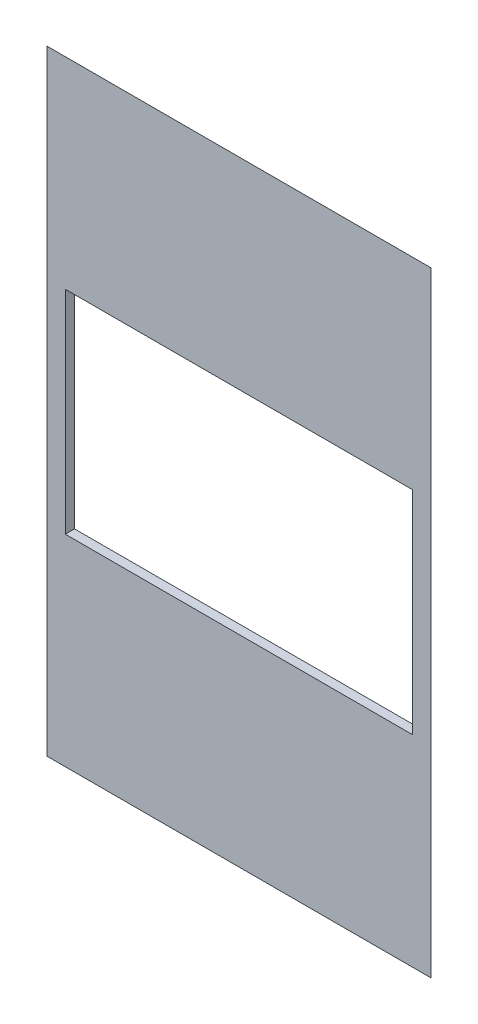
ISO-10303-21;
HEADER;
FILE_DESCRIPTION(('STEP AP214'),'2;1');
FILE_NAME('part.step','',(''),(''),'','','');
FILE_SCHEMA(('AUTOMOTIVE_DESIGN { 1 0 10303 214 1 1 1 1 }'));
ENDSEC;
DATA;
#1=APPLICATION_CONTEXT('core data for automotive mechanical design processes');
#2=APPLICATION_PROTOCOL_DEFINITION('international standard','automotive_design',2000,#1);
#3=PRODUCT_CONTEXT('',#1,'mechanical');
#4=PRODUCT('Part','Part','',(#3));
#5=PRODUCT_RELATED_PRODUCT_CATEGORY('part','',(#4));
#6=PRODUCT_DEFINITION_FORMATION('','',#4);
#7=PRODUCT_DEFINITION_CONTEXT('part definition',#1,'design');
#8=PRODUCT_DEFINITION('design','',#6,#7);
#9=PRODUCT_DEFINITION_SHAPE('','',#8);
#10=(LENGTH_UNIT() NAMED_UNIT(*) SI_UNIT(.MILLI.,.METRE.));
#11=(NAMED_UNIT(*) PLANE_ANGLE_UNIT() SI_UNIT($,.RADIAN.));
#12=(NAMED_UNIT(*) SI_UNIT($,.STERADIAN.) SOLID_ANGLE_UNIT());
#13=UNCERTAINTY_MEASURE_WITH_UNIT(LENGTH_MEASURE(1.E-05),#10,'distance_accuracy_value','');
#14=(GEOMETRIC_REPRESENTATION_CONTEXT(3) GLOBAL_UNCERTAINTY_ASSIGNED_CONTEXT((#13)) GLOBAL_UNIT_ASSIGNED_CONTEXT((#10,
#11,#12)) REPRESENTATION_CONTEXT('',''));
#15=CARTESIAN_POINT('',(0.,0.,0.));
#16=DIRECTION('',(0.,0.,1.));
#17=DIRECTION('',(1.,0.,0.));
#18=AXIS2_PLACEMENT_3D('',#15,#16,#17);
#19=CARTESIAN_POINT('',(0.,0.,12.));
#20=DIRECTION('',(0.,0.,1.));
#21=DIRECTION('',(1.,0.,0.));
#22=AXIS2_PLACEMENT_3D('',#19,#20,#21);
#23=PLANE('',#22);
#24=DIRECTION('',(0.,-1.,0.));
#25=VECTOR('',#24,1.);
#26=CARTESIAN_POINT('',(476.,0.,12.));
#27=LINE('',#26,#25);
#28=CARTESIAN_POINT('',(476.,538.,12.));
#29=VERTEX_POINT('',#28);
#30=CARTESIAN_POINT('',(476.,262.,12.));
#31=VERTEX_POINT('',#30);
#32=EDGE_CURVE('E126',#29,#31,#27,.T.);
#33=ORIENTED_EDGE('',*,*,#32,.T.);
#34=DIRECTION('',(1.,0.,0.));
#35=VECTOR('',#34,1.);
#36=CARTESIAN_POINT('',(0.,262.,12.));
#37=LINE('',#36,#35);
#38=CARTESIAN_POINT('',(24.,262.,12.));
#39=VERTEX_POINT('',#38);
#40=EDGE_CURVE('E141',#39,#31,#37,.T.);
#41=ORIENTED_EDGE('',*,*,#40,.F.);
#42=DIRECTION('',(0.,-1.,0.));
#43=VECTOR('',#42,1.);
#44=CARTESIAN_POINT('',(24.0000000000001,0.,12.));
#45=LINE('',#44,#43);
#46=CARTESIAN_POINT('',(24.,538.,12.));
#47=VERTEX_POINT('',#46);
#48=EDGE_CURVE('E137',#47,#39,#45,.T.);
#49=ORIENTED_EDGE('',*,*,#48,.F.);
#50=DIRECTION('',(1.,0.,0.));
#51=VECTOR('',#50,1.);
#52=CARTESIAN_POINT('',(0.,538.,12.));
#53=LINE('',#52,#51);
#54=EDGE_CURVE('E114',#47,#29,#53,.T.);
#55=ORIENTED_EDGE('',*,*,#54,.T.);
#56=EDGE_LOOP('',(#33,#41,#49,#55));
#57=FACE_BOUND('',#56,.T.);
#58=DIRECTION('',(1.,0.,0.));
#59=VECTOR('',#58,1.);
#60=CARTESIAN_POINT('',(0.,800.,12.));
#61=LINE('',#60,#59);
#62=CARTESIAN_POINT('',(0.,800.,12.));
#63=VERTEX_POINT('',#62);
#64=CARTESIAN_POINT('',(500.,800.,12.));
#65=VERTEX_POINT('',#64);
#66=EDGE_CURVE('E121',#63,#65,#61,.T.);
#67=ORIENTED_EDGE('',*,*,#66,.F.);
#68=DIRECTION('',(0.,1.,0.));
#69=VECTOR('',#68,1.);
#70=CARTESIAN_POINT('',(0.,0.,12.));
#71=LINE('',#70,#69);
#72=CARTESIAN_POINT('',(0.,0.,12.));
#73=VERTEX_POINT('',#72);
#74=EDGE_CURVE('E175',#73,#63,#71,.T.);
#75=ORIENTED_EDGE('',*,*,#74,.F.);
#76=DIRECTION('',(1.,0.,0.));
#77=VECTOR('',#76,1.);
#78=CARTESIAN_POINT('',(0.,0.,12.));
#79=LINE('',#78,#77);
#80=CARTESIAN_POINT('',(500.,0.,12.));
#81=VERTEX_POINT('',#80);
#82=EDGE_CURVE('E171',#73,#81,#79,.T.);
#83=ORIENTED_EDGE('',*,*,#82,.T.);
#84=DIRECTION('',(0.,1.,0.));
#85=VECTOR('',#84,1.);
#86=CARTESIAN_POINT('',(500.,0.,12.));
#87=LINE('',#86,#85);
#88=EDGE_CURVE('E168',#81,#65,#87,.T.);
#89=ORIENTED_EDGE('',*,*,#88,.T.);
#90=EDGE_LOOP('',(#67,#75,#83,#89));
#91=FACE_BOUND('',#90,.T.);
#92=ADVANCED_FACE('F41',(#57,#91),#23,.T.);
#93=CARTESIAN_POINT('',(0.,0.,0.));
#94=DIRECTION('',(0.,0.,1.));
#95=DIRECTION('',(1.,0.,0.));
#96=AXIS2_PLACEMENT_3D('',#93,#94,#95);
#97=PLANE('',#96);
#98=DIRECTION('',(0.,-1.,0.));
#99=VECTOR('',#98,1.);
#100=CARTESIAN_POINT('',(488.,0.,0.));
#101=LINE('',#100,#99);
#102=CARTESIAN_POINT('',(488.,788.,0.));
#103=VERTEX_POINT('',#102);
#104=CARTESIAN_POINT('',(488.,12.,0.));
#105=VERTEX_POINT('',#104);
#106=EDGE_CURVE('E179',#103,#105,#101,.T.);
#107=ORIENTED_EDGE('',*,*,#106,.T.);
#108=DIRECTION('',(-1.,0.,0.));
#109=VECTOR('',#108,1.);
#110=CARTESIAN_POINT('',(0.,12.,0.));
#111=LINE('',#110,#109);
#112=CARTESIAN_POINT('',(12.,12.,0.));
#113=VERTEX_POINT('',#112);
#114=EDGE_CURVE('E11',#105,#113,#111,.T.);
#115=ORIENTED_EDGE('',*,*,#114,.T.);
#116=DIRECTION('',(0.,1.,0.));
#117=VECTOR('',#116,1.);
#118=CARTESIAN_POINT('',(12.,800.,0.));
#119=LINE('',#118,#117);
#120=CARTESIAN_POINT('',(12.,788.,0.));
#121=VERTEX_POINT('',#120);
#122=EDGE_CURVE('E52',#113,#121,#119,.T.);
#123=ORIENTED_EDGE('',*,*,#122,.T.);
#124=DIRECTION('',(1.,0.,0.));
#125=VECTOR('',#124,1.);
#126=CARTESIAN_POINT('',(500.,788.,0.));
#127=LINE('',#126,#125);
#128=EDGE_CURVE('E182',#121,#103,#127,.T.);
#129=ORIENTED_EDGE('',*,*,#128,.T.);
#130=EDGE_LOOP('',(#107,#115,#123,#129));
#131=FACE_BOUND('',#130,.T.);
#132=DIRECTION('',(1.,0.,0.));
#133=VECTOR('',#132,1.);
#134=CARTESIAN_POINT('',(0.,262.,0.));
#135=LINE('',#134,#133);
#136=CARTESIAN_POINT('',(24.,262.,0.));
#137=VERTEX_POINT('',#136);
#138=CARTESIAN_POINT('',(476.,262.,0.));
#139=VERTEX_POINT('',#138);
#140=EDGE_CURVE('E133',#137,#139,#135,.T.);
#141=ORIENTED_EDGE('',*,*,#140,.T.);
#142=DIRECTION('',(0.,-1.,0.));
#143=VECTOR('',#142,1.);
#144=CARTESIAN_POINT('',(476.,0.,0.));
#145=LINE('',#144,#143);
#146=CARTESIAN_POINT('',(476.,538.,0.));
#147=VERTEX_POINT('',#146);
#148=EDGE_CURVE('E146',#147,#139,#145,.T.);
#149=ORIENTED_EDGE('',*,*,#148,.F.);
#150=DIRECTION('',(1.,0.,0.));
#151=VECTOR('',#150,1.);
#152=CARTESIAN_POINT('',(0.,538.,0.));
#153=LINE('',#152,#151);
#154=CARTESIAN_POINT('',(24.,538.,0.));
#155=VERTEX_POINT('',#154);
#156=EDGE_CURVE('E117',#155,#147,#153,.T.);
#157=ORIENTED_EDGE('',*,*,#156,.F.);
#158=DIRECTION('',(0.,-1.,0.));
#159=VECTOR('',#158,1.);
#160=CARTESIAN_POINT('',(24.0000000000001,0.,0.));
#161=LINE('',#160,#159);
#162=EDGE_CURVE('E151',#155,#137,#161,.T.);
#163=ORIENTED_EDGE('',*,*,#162,.T.);
#164=EDGE_LOOP('',(#141,#149,#157,#163));
#165=FACE_BOUND('',#164,.T.);
#166=ADVANCED_FACE('F204',(#131,#165),#97,.F.);
#167=CARTESIAN_POINT('',(476.,0.,12.));
#168=DIRECTION('',(1.,0.,0.));
#169=DIRECTION('',(0.,1.,0.));
#170=AXIS2_PLACEMENT_3D('',#167,#168,#169);
#171=PLANE('',#170);
#172=ORIENTED_EDGE('',*,*,#148,.T.);
#173=DIRECTION('',(0.,0.,-1.));
#174=VECTOR('',#173,1.);
#175=CARTESIAN_POINT('',(476.,262.,12.));
#176=LINE('',#175,#174);
#177=EDGE_CURVE('E129',#31,#139,#176,.T.);
#178=ORIENTED_EDGE('',*,*,#177,.F.);
#179=ORIENTED_EDGE('',*,*,#32,.F.);
#180=DIRECTION('',(0.,0.,-1.));
#181=VECTOR('',#180,1.);
#182=CARTESIAN_POINT('',(476.,538.,12.));
#183=LINE('',#182,#181);
#184=EDGE_CURVE('E110',#29,#147,#183,.T.);
#185=ORIENTED_EDGE('',*,*,#184,.T.);
#186=EDGE_LOOP('',(#172,#178,#179,#185));
#187=FACE_BOUND('',#186,.T.);
#188=ADVANCED_FACE('F127',(#187),#171,.F.);
#189=CARTESIAN_POINT('',(0.,538.,12.));
#190=DIRECTION('',(0.,1.,0.));
#191=DIRECTION('',(0.,0.,1.));
#192=AXIS2_PLACEMENT_3D('',#189,#190,#191);
#193=PLANE('',#192);
#194=ORIENTED_EDGE('',*,*,#156,.T.);
#195=ORIENTED_EDGE('',*,*,#184,.F.);
#196=ORIENTED_EDGE('',*,*,#54,.F.);
#197=DIRECTION('',(0.,0.,-1.));
#198=VECTOR('',#197,1.);
#199=CARTESIAN_POINT('',(24.,538.,12.));
#200=LINE('',#199,#198);
#201=EDGE_CURVE('E122',#47,#155,#200,.T.);
#202=ORIENTED_EDGE('',*,*,#201,.T.);
#203=EDGE_LOOP('',(#194,#195,#196,#202));
#204=FACE_BOUND('',#203,.T.);
#205=ADVANCED_FACE('F112',(#204),#193,.F.);
#206=CARTESIAN_POINT('',(24.0000000000001,0.,12.));
#207=DIRECTION('',(1.,0.,0.));
#208=DIRECTION('',(0.,1.,0.));
#209=AXIS2_PLACEMENT_3D('',#206,#207,#208);
#210=PLANE('',#209);
#211=ORIENTED_EDGE('',*,*,#162,.F.);
#212=ORIENTED_EDGE('',*,*,#201,.F.);
#213=ORIENTED_EDGE('',*,*,#48,.T.);
#214=DIRECTION('',(0.,0.,-1.));
#215=VECTOR('',#214,1.);
#216=CARTESIAN_POINT('',(24.,262.,12.));
#217=LINE('',#216,#215);
#218=EDGE_CURVE('E160',#39,#137,#217,.T.);
#219=ORIENTED_EDGE('',*,*,#218,.T.);
#220=EDGE_LOOP('',(#211,#212,#213,#219));
#221=FACE_BOUND('',#220,.T.);
#222=ADVANCED_FACE('F238',(#221),#210,.T.);
#223=CARTESIAN_POINT('',(0.,262.,12.));
#224=DIRECTION('',(0.,1.,0.));
#225=DIRECTION('',(0.,0.,1.));
#226=AXIS2_PLACEMENT_3D('',#223,#224,#225);
#227=PLANE('',#226);
#228=ORIENTED_EDGE('',*,*,#140,.F.);
#229=ORIENTED_EDGE('',*,*,#218,.F.);
#230=ORIENTED_EDGE('',*,*,#40,.T.);
#231=ORIENTED_EDGE('',*,*,#177,.T.);
#232=EDGE_LOOP('',(#228,#229,#230,#231));
#233=FACE_BOUND('',#232,.T.);
#234=ADVANCED_FACE('F234',(#233),#227,.T.);
#235=CARTESIAN_POINT('',(0.,788.,0.));
#236=DIRECTION('',(0.,0.707106781186547,-0.707106781186548));
#237=DIRECTION('',(-1.,0.,0.));
#238=AXIS2_PLACEMENT_3D('',#235,#236,#237);
#239=PLANE('',#238);
#240=DIRECTION('',(-0.577350269189626,-0.577350269189626,-0.577350269189625));
#241=VECTOR('',#240,1.);
#242=CARTESIAN_POINT('',(233.333333333333,533.333333333333,-254.666666666667));
#243=LINE('',#242,#241);
#244=EDGE_CURVE('E191',#103,#65,#243,.F.);
#245=ORIENTED_EDGE('',*,*,#244,.F.);
#246=ORIENTED_EDGE('',*,*,#128,.F.);
#247=DIRECTION('',(-0.577350269189626,0.577350269189626,0.577350269189625));
#248=VECTOR('',#247,1.);
#249=CARTESIAN_POINT('',(8.00000000000001,792.,4.));
#250=LINE('',#249,#248);
#251=EDGE_CURVE('E46',#63,#121,#250,.F.);
#252=ORIENTED_EDGE('',*,*,#251,.F.);
#253=ORIENTED_EDGE('',*,*,#66,.T.);
#254=EDGE_LOOP('',(#245,#246,#252,#253));
#255=FACE_BOUND('',#254,.T.);
#256=ADVANCED_FACE('F44',(#255),#239,.T.);
#257=CARTESIAN_POINT('',(12.,0.,0.));
#258=DIRECTION('',(-0.707106781186547,0.,-0.707106781186548));
#259=DIRECTION('',(0.,-1.,0.));
#260=AXIS2_PLACEMENT_3D('',#257,#258,#259);
#261=PLANE('',#260);
#262=ORIENTED_EDGE('',*,*,#251,.T.);
#263=ORIENTED_EDGE('',*,*,#122,.F.);
#264=DIRECTION('',(0.577350269189626,0.577350269189626,-0.577350269189625));
#265=VECTOR('',#264,1.);
#266=CARTESIAN_POINT('',(8.,8.00000000000001,4.));
#267=LINE('',#266,#265);
#268=EDGE_CURVE('E60',#73,#113,#267,.T.);
#269=ORIENTED_EDGE('',*,*,#268,.F.);
#270=ORIENTED_EDGE('',*,*,#74,.T.);
#271=EDGE_LOOP('',(#262,#263,#269,#270));
#272=FACE_BOUND('',#271,.T.);
#273=ADVANCED_FACE('F202',(#272),#261,.T.);
#274=CARTESIAN_POINT('',(500.,0.,12.));
#275=DIRECTION('',(-0.707106781186547,0.,0.707106781186548));
#276=DIRECTION('',(0.,1.,0.));
#277=AXIS2_PLACEMENT_3D('',#274,#275,#276);
#278=PLANE('',#277);
#279=ORIENTED_EDGE('',*,*,#244,.T.);
#280=ORIENTED_EDGE('',*,*,#88,.F.);
#281=DIRECTION('',(-0.577350269189626,0.577350269189626,-0.577350269189625));
#282=VECTOR('',#281,1.);
#283=CARTESIAN_POINT('',(500.,0.,12.));
#284=LINE('',#283,#282);
#285=EDGE_CURVE('E187',#105,#81,#284,.F.);
#286=ORIENTED_EDGE('',*,*,#285,.F.);
#287=ORIENTED_EDGE('',*,*,#106,.F.);
#288=EDGE_LOOP('',(#279,#280,#286,#287));
#289=FACE_BOUND('',#288,.T.);
#290=ADVANCED_FACE('F208',(#289),#278,.F.);
#291=CARTESIAN_POINT('',(0.,0.,12.));
#292=DIRECTION('',(0.,0.707106781186547,0.707106781186548));
#293=DIRECTION('',(1.,0.,0.));
#294=AXIS2_PLACEMENT_3D('',#291,#292,#293);
#295=PLANE('',#294);
#296=ORIENTED_EDGE('',*,*,#268,.T.);
#297=ORIENTED_EDGE('',*,*,#114,.F.);
#298=ORIENTED_EDGE('',*,*,#285,.T.);
#299=ORIENTED_EDGE('',*,*,#82,.F.);
#300=EDGE_LOOP('',(#296,#297,#298,#299));
#301=FACE_BOUND('',#300,.T.);
#302=ADVANCED_FACE('F207',(#301),#295,.F.);
#303=CLOSED_SHELL('',(#92,#166,#188,#205,#222,#234,#256,#273,#290,#302));
#304=MANIFOLD_SOLID_BREP('B2',#303);
#305=ADVANCED_BREP_SHAPE_REPRESENTATION('',(#18,#304),#14);
#306=SHAPE_DEFINITION_REPRESENTATION(#9,#305);
ENDSEC;
END-ISO-10303-21;
